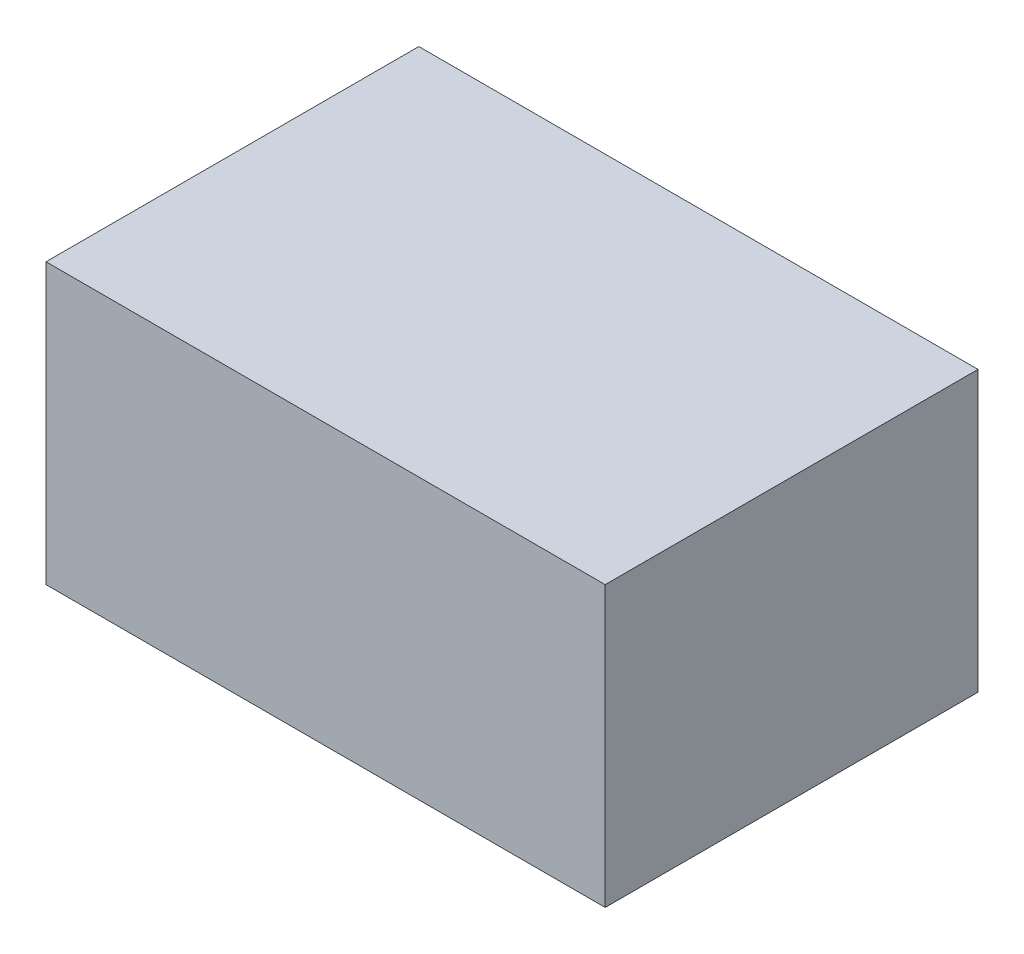
ISO-10303-21;
HEADER;
FILE_DESCRIPTION(('STEP AP214'),'2;1');
FILE_NAME('part.step','',(''),(''),'','','');
FILE_SCHEMA(('AUTOMOTIVE_DESIGN { 1 0 10303 214 1 1 1 1 }'));
ENDSEC;
DATA;
#1=APPLICATION_CONTEXT('core data for automotive mechanical design processes');
#2=APPLICATION_PROTOCOL_DEFINITION('international standard','automotive_design',2000,#1);
#3=PRODUCT_CONTEXT('',#1,'mechanical');
#4=PRODUCT('Part','Part','',(#3));
#5=PRODUCT_RELATED_PRODUCT_CATEGORY('part','',(#4));
#6=PRODUCT_DEFINITION_FORMATION('','',#4);
#7=PRODUCT_DEFINITION_CONTEXT('part definition',#1,'design');
#8=PRODUCT_DEFINITION('design','',#6,#7);
#9=PRODUCT_DEFINITION_SHAPE('','',#8);
#10=(LENGTH_UNIT() NAMED_UNIT(*) SI_UNIT(.MILLI.,.METRE.));
#11=(NAMED_UNIT(*) PLANE_ANGLE_UNIT() SI_UNIT($,.RADIAN.));
#12=(NAMED_UNIT(*) SI_UNIT($,.STERADIAN.) SOLID_ANGLE_UNIT());
#13=UNCERTAINTY_MEASURE_WITH_UNIT(LENGTH_MEASURE(1.E-05),#10,'distance_accuracy_value','');
#14=(GEOMETRIC_REPRESENTATION_CONTEXT(3) GLOBAL_UNCERTAINTY_ASSIGNED_CONTEXT((#13)) GLOBAL_UNIT_ASSIGNED_CONTEXT((#10,
#11,#12)) REPRESENTATION_CONTEXT('',''));
#15=CARTESIAN_POINT('',(0.,0.,0.));
#16=DIRECTION('',(0.,0.,1.));
#17=DIRECTION('',(1.,0.,0.));
#18=AXIS2_PLACEMENT_3D('',#15,#16,#17);
#19=CARTESIAN_POINT('',(0.,0.,0.));
#20=DIRECTION('',(0.,-1.,0.));
#21=DIRECTION('',(0.,0.,-1.));
#22=AXIS2_PLACEMENT_3D('',#19,#20,#21);
#23=PLANE('',#22);
#24=DIRECTION('',(0.,0.,1.));
#25=VECTOR('',#24,1.);
#26=CARTESIAN_POINT('',(0.,0.,0.));
#27=LINE('',#26,#25);
#28=CARTESIAN_POINT('',(0.,0.,-80.));
#29=VERTEX_POINT('',#28);
#30=CARTESIAN_POINT('',(0.,0.,0.));
#31=VERTEX_POINT('',#30);
#32=EDGE_CURVE('E129',#29,#31,#27,.T.);
#33=ORIENTED_EDGE('',*,*,#32,.F.);
#34=DIRECTION('',(-1.,0.,0.));
#35=VECTOR('',#34,1.);
#36=CARTESIAN_POINT('',(0.,0.,-80.));
#37=LINE('',#36,#35);
#38=CARTESIAN_POINT('',(120.,0.,-80.));
#39=VERTEX_POINT('',#38);
#40=EDGE_CURVE('E77',#39,#29,#37,.T.);
#41=ORIENTED_EDGE('',*,*,#40,.F.);
#42=DIRECTION('',(0.,0.,-1.));
#43=VECTOR('',#42,1.);
#44=CARTESIAN_POINT('',(120.,0.,0.));
#45=LINE('',#44,#43);
#46=CARTESIAN_POINT('',(120.,0.,0.));
#47=VERTEX_POINT('',#46);
#48=EDGE_CURVE('E157',#47,#39,#45,.T.);
#49=ORIENTED_EDGE('',*,*,#48,.F.);
#50=DIRECTION('',(1.,0.,0.));
#51=VECTOR('',#50,1.);
#52=CARTESIAN_POINT('',(0.,0.,0.));
#53=LINE('',#52,#51);
#54=EDGE_CURVE('E133',#31,#47,#53,.T.);
#55=ORIENTED_EDGE('',*,*,#54,.F.);
#56=EDGE_LOOP('',(#33,#41,#49,#55));
#57=FACE_BOUND('',#56,.T.);
#58=DIRECTION('',(-1.,0.,0.));
#59=VECTOR('',#58,1.);
#60=CARTESIAN_POINT('',(0.,0.,-75.));
#61=LINE('',#60,#59);
#62=CARTESIAN_POINT('',(115.,0.,-75.));
#63=VERTEX_POINT('',#62);
#64=CARTESIAN_POINT('',(5.,0.,-75.));
#65=VERTEX_POINT('',#64);
#66=EDGE_CURVE('E124',#63,#65,#61,.T.);
#67=ORIENTED_EDGE('',*,*,#66,.T.);
#68=DIRECTION('',(0.,0.,1.));
#69=VECTOR('',#68,1.);
#70=CARTESIAN_POINT('',(5.,0.,0.));
#71=LINE('',#70,#69);
#72=CARTESIAN_POINT('',(5.,0.,-5.));
#73=VERTEX_POINT('',#72);
#74=EDGE_CURVE('E143',#65,#73,#71,.T.);
#75=ORIENTED_EDGE('',*,*,#74,.T.);
#76=DIRECTION('',(1.,0.,0.));
#77=VECTOR('',#76,1.);
#78=CARTESIAN_POINT('',(0.,0.,-5.));
#79=LINE('',#78,#77);
#80=CARTESIAN_POINT('',(115.,0.,-5.));
#81=VERTEX_POINT('',#80);
#82=EDGE_CURVE('E128',#73,#81,#79,.T.);
#83=ORIENTED_EDGE('',*,*,#82,.T.);
#84=DIRECTION('',(0.,0.,-1.));
#85=VECTOR('',#84,1.);
#86=CARTESIAN_POINT('',(115.,0.,0.));
#87=LINE('',#86,#85);
#88=EDGE_CURVE('E47',#81,#63,#87,.T.);
#89=ORIENTED_EDGE('',*,*,#88,.T.);
#90=EDGE_LOOP('',(#67,#75,#83,#89));
#91=FACE_BOUND('',#90,.T.);
#92=ADVANCED_FACE('F32',(#57,#91),#23,.T.);
#93=CARTESIAN_POINT('',(0.,60.,0.));
#94=DIRECTION('',(1.,0.,0.));
#95=DIRECTION('',(0.,0.,-1.));
#96=AXIS2_PLACEMENT_3D('',#93,#94,#95);
#97=PLANE('',#96);
#98=ORIENTED_EDGE('',*,*,#32,.T.);
#99=DIRECTION('',(0.,-1.,0.));
#100=VECTOR('',#99,1.);
#101=CARTESIAN_POINT('',(0.,60.,0.));
#102=LINE('',#101,#100);
#103=CARTESIAN_POINT('',(0.,60.,0.));
#104=VERTEX_POINT('',#103);
#105=EDGE_CURVE('E11',#104,#31,#102,.T.);
#106=ORIENTED_EDGE('',*,*,#105,.F.);
#107=DIRECTION('',(0.,0.,1.));
#108=VECTOR('',#107,1.);
#109=CARTESIAN_POINT('',(0.,60.,0.));
#110=LINE('',#109,#108);
#111=CARTESIAN_POINT('',(0.,60.,-80.));
#112=VERTEX_POINT('',#111);
#113=EDGE_CURVE('E149',#112,#104,#110,.T.);
#114=ORIENTED_EDGE('',*,*,#113,.F.);
#115=DIRECTION('',(0.,-1.,0.));
#116=VECTOR('',#115,1.);
#117=CARTESIAN_POINT('',(0.,60.,-80.));
#118=LINE('',#117,#116);
#119=EDGE_CURVE('E154',#112,#29,#118,.T.);
#120=ORIENTED_EDGE('',*,*,#119,.T.);
#121=EDGE_LOOP('',(#98,#106,#114,#120));
#122=FACE_BOUND('',#121,.T.);
#123=ADVANCED_FACE('F34',(#122),#97,.F.);
#124=CARTESIAN_POINT('',(0.,60.,0.));
#125=DIRECTION('',(0.,0.,-1.));
#126=DIRECTION('',(-1.,0.,0.));
#127=AXIS2_PLACEMENT_3D('',#124,#125,#126);
#128=PLANE('',#127);
#129=ORIENTED_EDGE('',*,*,#54,.T.);
#130=DIRECTION('',(0.,-1.,0.));
#131=VECTOR('',#130,1.);
#132=CARTESIAN_POINT('',(120.,60.,0.));
#133=LINE('',#132,#131);
#134=CARTESIAN_POINT('',(120.,60.,0.));
#135=VERTEX_POINT('',#134);
#136=EDGE_CURVE('E40',#135,#47,#133,.T.);
#137=ORIENTED_EDGE('',*,*,#136,.F.);
#138=DIRECTION('',(1.,0.,0.));
#139=VECTOR('',#138,1.);
#140=CARTESIAN_POINT('',(0.,60.,0.));
#141=LINE('',#140,#139);
#142=EDGE_CURVE('E84',#104,#135,#141,.T.);
#143=ORIENTED_EDGE('',*,*,#142,.F.);
#144=ORIENTED_EDGE('',*,*,#105,.T.);
#145=EDGE_LOOP('',(#129,#137,#143,#144));
#146=FACE_BOUND('',#145,.T.);
#147=ADVANCED_FACE('F183',(#146),#128,.F.);
#148=CARTESIAN_POINT('',(120.,60.,0.));
#149=DIRECTION('',(-1.,0.,0.));
#150=DIRECTION('',(0.,0.,1.));
#151=AXIS2_PLACEMENT_3D('',#148,#149,#150);
#152=PLANE('',#151);
#153=ORIENTED_EDGE('',*,*,#48,.T.);
#154=DIRECTION('',(0.,-1.,0.));
#155=VECTOR('',#154,1.);
#156=CARTESIAN_POINT('',(120.,60.,-80.));
#157=LINE('',#156,#155);
#158=CARTESIAN_POINT('',(120.,60.,-80.));
#159=VERTEX_POINT('',#158);
#160=EDGE_CURVE('E161',#159,#39,#157,.T.);
#161=ORIENTED_EDGE('',*,*,#160,.F.);
#162=DIRECTION('',(0.,0.,-1.));
#163=VECTOR('',#162,1.);
#164=CARTESIAN_POINT('',(120.,60.,0.));
#165=LINE('',#164,#163);
#166=EDGE_CURVE('E152',#135,#159,#165,.T.);
#167=ORIENTED_EDGE('',*,*,#166,.F.);
#168=ORIENTED_EDGE('',*,*,#136,.T.);
#169=EDGE_LOOP('',(#153,#161,#167,#168));
#170=FACE_BOUND('',#169,.T.);
#171=ADVANCED_FACE('F166',(#170),#152,.F.);
#172=CARTESIAN_POINT('',(0.,60.,-80.));
#173=DIRECTION('',(0.,0.,1.));
#174=DIRECTION('',(1.,0.,0.));
#175=AXIS2_PLACEMENT_3D('',#172,#173,#174);
#176=PLANE('',#175);
#177=ORIENTED_EDGE('',*,*,#40,.T.);
#178=ORIENTED_EDGE('',*,*,#119,.F.);
#179=DIRECTION('',(-1.,0.,0.));
#180=VECTOR('',#179,1.);
#181=CARTESIAN_POINT('',(0.,60.,-80.));
#182=LINE('',#181,#180);
#183=EDGE_CURVE('E56',#159,#112,#182,.T.);
#184=ORIENTED_EDGE('',*,*,#183,.F.);
#185=ORIENTED_EDGE('',*,*,#160,.T.);
#186=EDGE_LOOP('',(#177,#178,#184,#185));
#187=FACE_BOUND('',#186,.T.);
#188=ADVANCED_FACE('F174',(#187),#176,.F.);
#189=CARTESIAN_POINT('',(0.,60.,0.));
#190=DIRECTION('',(0.,-1.,0.));
#191=DIRECTION('',(0.,0.,-1.));
#192=AXIS2_PLACEMENT_3D('',#189,#190,#191);
#193=PLANE('',#192);
#194=ORIENTED_EDGE('',*,*,#113,.T.);
#195=ORIENTED_EDGE('',*,*,#142,.T.);
#196=ORIENTED_EDGE('',*,*,#166,.T.);
#197=ORIENTED_EDGE('',*,*,#183,.T.);
#198=EDGE_LOOP('',(#194,#195,#196,#197));
#199=FACE_BOUND('',#198,.T.);
#200=ADVANCED_FACE('F176',(#199),#193,.F.);
#201=CARTESIAN_POINT('',(5.,60.,0.));
#202=DIRECTION('',(1.,0.,0.));
#203=DIRECTION('',(0.,0.,-1.));
#204=AXIS2_PLACEMENT_3D('',#201,#202,#203);
#205=PLANE('',#204);
#206=ORIENTED_EDGE('',*,*,#74,.F.);
#207=DIRECTION('',(0.,-1.,0.));
#208=VECTOR('',#207,1.);
#209=CARTESIAN_POINT('',(5.,60.,-75.));
#210=LINE('',#209,#208);
#211=CARTESIAN_POINT('',(5.,55.,-75.));
#212=VERTEX_POINT('',#211);
#213=EDGE_CURVE('E123',#212,#65,#210,.T.);
#214=ORIENTED_EDGE('',*,*,#213,.F.);
#215=DIRECTION('',(0.,0.,1.));
#216=VECTOR('',#215,1.);
#217=CARTESIAN_POINT('',(5.,55.,0.));
#218=LINE('',#217,#216);
#219=CARTESIAN_POINT('',(5.,55.,-5.));
#220=VERTEX_POINT('',#219);
#221=EDGE_CURVE('E111',#212,#220,#218,.T.);
#222=ORIENTED_EDGE('',*,*,#221,.T.);
#223=DIRECTION('',(0.,-1.,0.));
#224=VECTOR('',#223,1.);
#225=CARTESIAN_POINT('',(5.,60.,-5.));
#226=LINE('',#225,#224);
#227=EDGE_CURVE('E121',#220,#73,#226,.T.);
#228=ORIENTED_EDGE('',*,*,#227,.T.);
#229=EDGE_LOOP('',(#206,#214,#222,#228));
#230=FACE_BOUND('',#229,.T.);
#231=ADVANCED_FACE('F120',(#230),#205,.T.);
#232=CARTESIAN_POINT('',(0.,60.,-5.));
#233=DIRECTION('',(0.,0.,-1.));
#234=DIRECTION('',(-1.,0.,0.));
#235=AXIS2_PLACEMENT_3D('',#232,#233,#234);
#236=PLANE('',#235);
#237=ORIENTED_EDGE('',*,*,#82,.F.);
#238=ORIENTED_EDGE('',*,*,#227,.F.);
#239=DIRECTION('',(1.,0.,0.));
#240=VECTOR('',#239,1.);
#241=CARTESIAN_POINT('',(0.,55.,-5.));
#242=LINE('',#241,#240);
#243=CARTESIAN_POINT('',(115.,55.,-5.));
#244=VERTEX_POINT('',#243);
#245=EDGE_CURVE('E107',#220,#244,#242,.T.);
#246=ORIENTED_EDGE('',*,*,#245,.T.);
#247=DIRECTION('',(0.,-1.,0.));
#248=VECTOR('',#247,1.);
#249=CARTESIAN_POINT('',(115.,60.,-5.));
#250=LINE('',#249,#248);
#251=EDGE_CURVE('E130',#244,#81,#250,.T.);
#252=ORIENTED_EDGE('',*,*,#251,.T.);
#253=EDGE_LOOP('',(#237,#238,#246,#252));
#254=FACE_BOUND('',#253,.T.);
#255=ADVANCED_FACE('F126',(#254),#236,.T.);
#256=CARTESIAN_POINT('',(115.,60.,0.));
#257=DIRECTION('',(-1.,0.,0.));
#258=DIRECTION('',(0.,0.,1.));
#259=AXIS2_PLACEMENT_3D('',#256,#257,#258);
#260=PLANE('',#259);
#261=ORIENTED_EDGE('',*,*,#88,.F.);
#262=ORIENTED_EDGE('',*,*,#251,.F.);
#263=DIRECTION('',(0.,0.,-1.));
#264=VECTOR('',#263,1.);
#265=CARTESIAN_POINT('',(115.,55.,0.));
#266=LINE('',#265,#264);
#267=CARTESIAN_POINT('',(115.,55.,-75.));
#268=VERTEX_POINT('',#267);
#269=EDGE_CURVE('E112',#244,#268,#266,.T.);
#270=ORIENTED_EDGE('',*,*,#269,.T.);
#271=DIRECTION('',(0.,-1.,0.));
#272=VECTOR('',#271,1.);
#273=CARTESIAN_POINT('',(115.,60.,-75.));
#274=LINE('',#273,#272);
#275=EDGE_CURVE('E135',#268,#63,#274,.T.);
#276=ORIENTED_EDGE('',*,*,#275,.T.);
#277=EDGE_LOOP('',(#261,#262,#270,#276));
#278=FACE_BOUND('',#277,.T.);
#279=ADVANCED_FACE('F196',(#278),#260,.T.);
#280=CARTESIAN_POINT('',(0.,60.,-75.));
#281=DIRECTION('',(0.,0.,1.));
#282=DIRECTION('',(1.,0.,0.));
#283=AXIS2_PLACEMENT_3D('',#280,#281,#282);
#284=PLANE('',#283);
#285=ORIENTED_EDGE('',*,*,#66,.F.);
#286=ORIENTED_EDGE('',*,*,#275,.F.);
#287=DIRECTION('',(-1.,0.,0.));
#288=VECTOR('',#287,1.);
#289=CARTESIAN_POINT('',(0.,55.,-75.));
#290=LINE('',#289,#288);
#291=EDGE_CURVE('E138',#268,#212,#290,.T.);
#292=ORIENTED_EDGE('',*,*,#291,.T.);
#293=ORIENTED_EDGE('',*,*,#213,.T.);
#294=EDGE_LOOP('',(#285,#286,#292,#293));
#295=FACE_BOUND('',#294,.T.);
#296=ADVANCED_FACE('F193',(#295),#284,.T.);
#297=CARTESIAN_POINT('',(0.,55.,0.));
#298=DIRECTION('',(0.,-1.,0.));
#299=DIRECTION('',(0.,0.,-1.));
#300=AXIS2_PLACEMENT_3D('',#297,#298,#299);
#301=PLANE('',#300);
#302=ORIENTED_EDGE('',*,*,#221,.F.);
#303=ORIENTED_EDGE('',*,*,#291,.F.);
#304=ORIENTED_EDGE('',*,*,#269,.F.);
#305=ORIENTED_EDGE('',*,*,#245,.F.);
#306=EDGE_LOOP('',(#302,#303,#304,#305));
#307=FACE_BOUND('',#306,.T.);
#308=ADVANCED_FACE('F109',(#307),#301,.T.);
#309=CLOSED_SHELL('',(#92,#123,#147,#171,#188,#200,#231,#255,#279,#296,#308));
#310=MANIFOLD_SOLID_BREP('B2',#309);
#311=ADVANCED_BREP_SHAPE_REPRESENTATION('',(#18,#310),#14);
#312=SHAPE_DEFINITION_REPRESENTATION(#9,#311);
ENDSEC;
END-ISO-10303-21;
